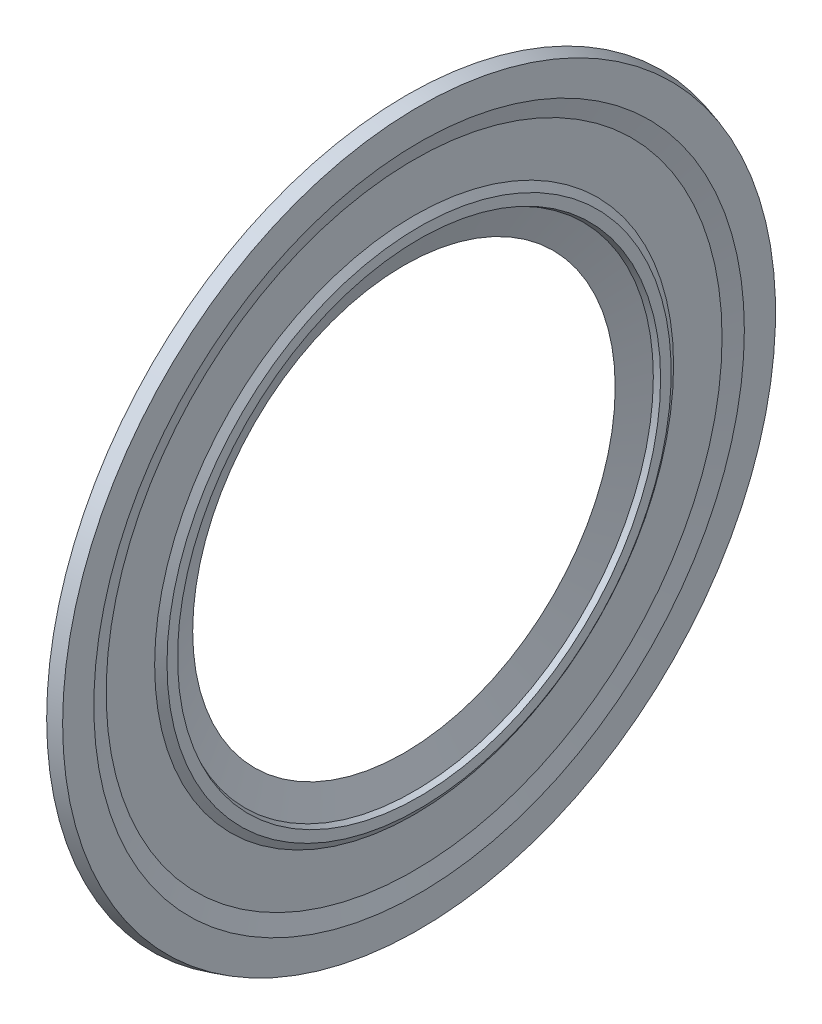
ISO-10303-21;
HEADER;
FILE_DESCRIPTION(('STEP AP214'),'2;1');
FILE_NAME('part.step','',(''),(''),'','','');
FILE_SCHEMA(('AUTOMOTIVE_DESIGN { 1 0 10303 214 1 1 1 1 }'));
ENDSEC;
DATA;
#1=APPLICATION_CONTEXT('core data for automotive mechanical design processes');
#2=APPLICATION_PROTOCOL_DEFINITION('international standard','automotive_design',2000,#1);
#3=PRODUCT_CONTEXT('',#1,'mechanical');
#4=PRODUCT('Part','Part','',(#3));
#5=PRODUCT_RELATED_PRODUCT_CATEGORY('part','',(#4));
#6=PRODUCT_DEFINITION_FORMATION('','',#4);
#7=PRODUCT_DEFINITION_CONTEXT('part definition',#1,'design');
#8=PRODUCT_DEFINITION('design','',#6,#7);
#9=PRODUCT_DEFINITION_SHAPE('','',#8);
#10=(LENGTH_UNIT() NAMED_UNIT(*) SI_UNIT(.MILLI.,.METRE.));
#11=(NAMED_UNIT(*) PLANE_ANGLE_UNIT() SI_UNIT($,.RADIAN.));
#12=(NAMED_UNIT(*) SI_UNIT($,.STERADIAN.) SOLID_ANGLE_UNIT());
#13=UNCERTAINTY_MEASURE_WITH_UNIT(LENGTH_MEASURE(1.E-05),#10,'distance_accuracy_value','');
#14=(GEOMETRIC_REPRESENTATION_CONTEXT(3) GLOBAL_UNCERTAINTY_ASSIGNED_CONTEXT((#13)) GLOBAL_UNIT_ASSIGNED_CONTEXT((#10,
#11,#12)) REPRESENTATION_CONTEXT('',''));
#15=CARTESIAN_POINT('',(0.,0.,0.));
#16=DIRECTION('',(0.,0.,1.));
#17=DIRECTION('',(1.,0.,0.));
#18=AXIS2_PLACEMENT_3D('',#15,#16,#17);
#19=CARTESIAN_POINT('',(5.772,6.16567962003259,0.));
#20=DIRECTION('',(1.,0.,0.));
#21=DIRECTION('',(0.,0.,-1.));
#22=AXIS2_PLACEMENT_3D('',#19,#20,#21);
#23=PLANE('',#22);
#24=CARTESIAN_POINT('',(5.77199999997902,0.,0.));
#25=DIRECTION('',(-1.,0.,0.));
#26=DIRECTION('',(0.,0.,1.));
#27=AXIS2_PLACEMENT_3D('',#24,#25,#26);
#28=CIRCLE('',#27,5.63899999997375);
#29=CARTESIAN_POINT('',(5.77199999997902,0.,5.63899999997375));
#30=VERTEX_POINT('',#29);
#31=EDGE_CURVE('E19',#30,#30,#28,.F.);
#32=ORIENTED_EDGE('',*,*,#31,.F.);
#33=EDGE_LOOP('',(#32));
#34=FACE_BOUND('',#33,.T.);
#35=CARTESIAN_POINT('',(5.77199999997902,0.,0.));
#36=DIRECTION('',(1.,0.,0.));
#37=DIRECTION('',(0.,0.,-1.));
#38=AXIS2_PLACEMENT_3D('',#35,#36,#37);
#39=CIRCLE('',#38,6.69235924004852);
#40=CARTESIAN_POINT('',(5.77199999997902,0.,-6.69235924004852));
#41=VERTEX_POINT('',#40);
#42=EDGE_CURVE('E50',#41,#41,#39,.T.);
#43=ORIENTED_EDGE('',*,*,#42,.T.);
#44=EDGE_LOOP('',(#43));
#45=FACE_BOUND('',#44,.T.);
#46=ADVANCED_FACE('F16',(#34,#45),#23,.T.);
#47=CARTESIAN_POINT('',(5.77199999997902,0.,0.));
#48=DIRECTION('',(-1.,0.,0.));
#49=DIRECTION('',(0.,0.,1.));
#50=AXIS2_PLACEMENT_3D('',#47,#48,#49);
#51=CONICAL_SURFACE('',#50,5.63899999997375,0.977384381055969);
#52=CARTESIAN_POINT('',(5.87999999999056,0.,0.));
#53=DIRECTION('',(-1.,0.,0.));
#54=DIRECTION('',(0.,0.,1.));
#55=AXIS2_PLACEMENT_3D('',#52,#53,#54);
#56=CIRCLE('',#55,5.47888341537828);
#57=CARTESIAN_POINT('',(5.87999999999056,0.,5.47888341537828));
#58=VERTEX_POINT('',#57);
#59=EDGE_CURVE('E48',#58,#58,#56,.F.);
#60=ORIENTED_EDGE('',*,*,#59,.F.);
#61=EDGE_LOOP('',(#60));
#62=FACE_BOUND('',#61,.T.);
#63=ORIENTED_EDGE('',*,*,#31,.T.);
#64=EDGE_LOOP('',(#63));
#65=FACE_BOUND('',#64,.T.);
#66=ADVANCED_FACE('F57',(#62,#65),#51,.T.);
#67=CARTESIAN_POINT('',(5.87999999999056,0.,0.));
#68=DIRECTION('',(1.,0.,0.));
#69=DIRECTION('',(0.,0.,-1.));
#70=AXIS2_PLACEMENT_3D('',#67,#68,#69);
#71=CONICAL_SURFACE('',#70,7.06900000000132,1.29154364646014);
#72=ORIENTED_EDGE('',*,*,#42,.F.);
#73=EDGE_LOOP('',(#72));
#74=FACE_BOUND('',#73,.T.);
#75=CARTESIAN_POINT('',(5.87999999999056,0.,0.));
#76=DIRECTION('',(1.,0.,0.));
#77=DIRECTION('',(0.,0.,-1.));
#78=AXIS2_PLACEMENT_3D('',#75,#76,#77);
#79=CIRCLE('',#78,7.06900000000132);
#80=CARTESIAN_POINT('',(5.87999999999056,0.,-7.06900000000132));
#81=VERTEX_POINT('',#80);
#82=EDGE_CURVE('E45',#81,#81,#79,.F.);
#83=ORIENTED_EDGE('',*,*,#82,.F.);
#84=EDGE_LOOP('',(#83));
#85=FACE_BOUND('',#84,.T.);
#86=ADVANCED_FACE('F64',(#74,#85),#71,.F.);
#87=CARTESIAN_POINT('',(5.88,5.36394170770031,0.));
#88=DIRECTION('',(1.,0.,0.));
#89=DIRECTION('',(0.,0.,-1.));
#90=AXIS2_PLACEMENT_3D('',#87,#88,#89);
#91=PLANE('',#90);
#92=CARTESIAN_POINT('',(5.87999999999056,0.,0.));
#93=DIRECTION('',(1.,0.,0.));
#94=DIRECTION('',(0.,0.,-1.));
#95=AXIS2_PLACEMENT_3D('',#92,#93,#94);
#96=CIRCLE('',#95,5.24899999999207);
#97=CARTESIAN_POINT('',(5.87999999999056,0.,-5.24899999999207));
#98=VERTEX_POINT('',#97);
#99=EDGE_CURVE('E42',#98,#98,#96,.F.);
#100=ORIENTED_EDGE('',*,*,#99,.T.);
#101=EDGE_LOOP('',(#100));
#102=FACE_BOUND('',#101,.T.);
#103=ORIENTED_EDGE('',*,*,#59,.T.);
#104=EDGE_LOOP('',(#103));
#105=FACE_BOUND('',#104,.T.);
#106=ADVANCED_FACE('F125',(#102,#105),#91,.T.);
#107=CARTESIAN_POINT('',(5.88,7.40795472314553,0.));
#108=DIRECTION('',(1.,0.,0.));
#109=DIRECTION('',(0.,0.,-1.));
#110=AXIS2_PLACEMENT_3D('',#107,#108,#109);
#111=PLANE('',#110);
#112=ORIENTED_EDGE('',*,*,#82,.T.);
#113=EDGE_LOOP('',(#112));
#114=FACE_BOUND('',#113,.T.);
#115=CARTESIAN_POINT('',(5.88,0.,0.));
#116=DIRECTION('',(-1.,0.,0.));
#117=DIRECTION('',(0.,0.,1.));
#118=AXIS2_PLACEMENT_3D('',#115,#116,#117);
#119=CIRCLE('',#118,7.74690944629107);
#120=CARTESIAN_POINT('',(5.88,0.,7.74690944629107));
#121=VERTEX_POINT('',#120);
#122=EDGE_CURVE('E39',#121,#121,#119,.T.);
#123=ORIENTED_EDGE('',*,*,#122,.F.);
#124=EDGE_LOOP('',(#123));
#125=FACE_BOUND('',#124,.T.);
#126=ADVANCED_FACE('F121',(#114,#125),#111,.T.);
#127=CARTESIAN_POINT('',(5.87999999999056,0.,0.));
#128=DIRECTION('',(1.,0.,0.));
#129=DIRECTION('',(0.,0.,-1.));
#130=AXIS2_PLACEMENT_3D('',#127,#128,#129);
#131=CONICAL_SURFACE('',#130,5.24899999999207,0.436332313074606);
#132=ORIENTED_EDGE('',*,*,#99,.F.);
#133=EDGE_LOOP('',(#132));
#134=FACE_BOUND('',#133,.T.);
#135=CARTESIAN_POINT('',(5.77200000000744,0.,0.));
#136=DIRECTION('',(1.,0.,0.));
#137=DIRECTION('',(0.,1.,0.));
#138=AXIS2_PLACEMENT_3D('',#135,#136,#137);
#139=CIRCLE('',#138,5.19863877292437);
#140=CARTESIAN_POINT('',(5.77200000000744,5.19863877292437,0.));
#141=VERTEX_POINT('',#140);
#142=EDGE_CURVE('E37',#141,#141,#139,.F.);
#143=ORIENTED_EDGE('',*,*,#142,.T.);
#144=EDGE_LOOP('',(#143));
#145=FACE_BOUND('',#144,.T.);
#146=ADVANCED_FACE('F103',(#134,#145),#131,.F.);
#147=CARTESIAN_POINT('',(5.61022769398884,0.,0.));
#148=DIRECTION('',(-1.,0.,0.));
#149=DIRECTION('',(0.,0.,1.));
#150=AXIS2_PLACEMENT_3D('',#147,#148,#149);
#151=CONICAL_SURFACE('',#150,7.82426541024528,0.279252680319085);
#152=ORIENTED_EDGE('',*,*,#122,.T.);
#153=EDGE_LOOP('',(#152));
#154=FACE_BOUND('',#153,.T.);
#155=CARTESIAN_POINT('',(5.61022769398884,0.,0.));
#156=DIRECTION('',(1.,0.,0.));
#157=DIRECTION('',(0.,1.,0.));
#158=AXIS2_PLACEMENT_3D('',#155,#156,#157);
#159=CIRCLE('',#158,7.82426541024527);
#160=CARTESIAN_POINT('',(5.61022769398884,7.82426541024527,0.));
#161=VERTEX_POINT('',#160);
#162=EDGE_CURVE('E33',#161,#161,#159,.F.);
#163=ORIENTED_EDGE('',*,*,#162,.F.);
#164=EDGE_LOOP('',(#163));
#165=FACE_BOUND('',#164,.T.);
#166=ADVANCED_FACE('F108',(#154,#165),#151,.T.);
#167=CARTESIAN_POINT('',(5.77200000000744,0.,0.));
#168=DIRECTION('',(1.,0.,0.));
#169=DIRECTION('',(0.,0.,-1.));
#170=AXIS2_PLACEMENT_3D('',#167,#168,#169);
#171=CONICAL_SURFACE('',#170,5.19863877292437,1.22173047634779);
#172=ORIENTED_EDGE('',*,*,#142,.F.);
#173=EDGE_LOOP('',(#172));
#174=FACE_BOUND('',#173,.T.);
#175=CARTESIAN_POINT('',(5.55088648444606,0.,0.));
#176=DIRECTION('',(-1.,0.,0.));
#177=DIRECTION('',(0.,0.,1.));
#178=AXIS2_PLACEMENT_3D('',#175,#176,#177);
#179=CIRCLE('',#178,4.5911343817986);
#180=CARTESIAN_POINT('',(5.55088648444606,0.,4.5911343817986));
#181=VERTEX_POINT('',#180);
#182=EDGE_CURVE('E28',#181,#181,#179,.F.);
#183=ORIENTED_EDGE('',*,*,#182,.F.);
#184=EDGE_LOOP('',(#183));
#185=FACE_BOUND('',#184,.T.);
#186=ADVANCED_FACE('F105',(#174,#185),#171,.F.);
#187=CARTESIAN_POINT('',(5.61022769398884,0.,0.));
#188=DIRECTION('',(1.,0.,0.));
#189=DIRECTION('',(0.,0.,-1.));
#190=AXIS2_PLACEMENT_3D('',#187,#188,#189);
#191=CONICAL_SURFACE('',#190,7.82426541024527,1.1693705988362);
#192=ORIENTED_EDGE('',*,*,#162,.T.);
#193=EDGE_LOOP('',(#192));
#194=FACE_BOUND('',#193,.T.);
#195=CARTESIAN_POINT('',(5.4,0.,0.));
#196=DIRECTION('',(1.,0.,0.));
#197=DIRECTION('',(0.,0.,-1.));
#198=AXIS2_PLACEMENT_3D('',#195,#196,#197);
#199=CIRCLE('',#198,7.329);
#200=CARTESIAN_POINT('',(5.4,0.,-7.329));
#201=VERTEX_POINT('',#200);
#202=EDGE_CURVE('E23',#201,#201,#199,.F.);
#203=ORIENTED_EDGE('',*,*,#202,.F.);
#204=EDGE_LOOP('',(#203));
#205=FACE_BOUND('',#204,.T.);
#206=ADVANCED_FACE('F72',(#194,#205),#191,.T.);
#207=CARTESIAN_POINT('',(5.99999999999999,0.,0.));
#208=DIRECTION('',(-1.,0.,0.));
#209=DIRECTION('',(0.,0.,1.));
#210=AXIS2_PLACEMENT_3D('',#207,#208,#209);
#211=TOROIDAL_SURFACE('',#210,4.989,0.599999999999993);
#212=CARTESIAN_POINT('',(5.4,0.,0.));
#213=DIRECTION('',(-1.,0.,0.));
#214=DIRECTION('',(0.,0.,-1.));
#215=AXIS2_PLACEMENT_3D('',#212,#213,#214);
#216=CIRCLE('',#215,4.989);
#217=CARTESIAN_POINT('',(5.4,0.,-4.989));
#218=VERTEX_POINT('',#217);
#219=EDGE_CURVE('E10',#218,#218,#216,.F.);
#220=ORIENTED_EDGE('',*,*,#219,.F.);
#221=EDGE_LOOP('',(#220));
#222=FACE_BOUND('',#221,.T.);
#223=ORIENTED_EDGE('',*,*,#182,.T.);
#224=EDGE_LOOP('',(#223));
#225=FACE_BOUND('',#224,.T.);
#226=ADVANCED_FACE('F68',(#222,#225),#211,.T.);
#227=CARTESIAN_POINT('',(5.4,6.159,0.));
#228=DIRECTION('',(-1.,0.,0.));
#229=DIRECTION('',(0.,0.,1.));
#230=AXIS2_PLACEMENT_3D('',#227,#228,#229);
#231=PLANE('',#230);
#232=ORIENTED_EDGE('',*,*,#219,.T.);
#233=EDGE_LOOP('',(#232));
#234=FACE_BOUND('',#233,.T.);
#235=ORIENTED_EDGE('',*,*,#202,.T.);
#236=EDGE_LOOP('',(#235));
#237=FACE_BOUND('',#236,.T.);
#238=ADVANCED_FACE('F66',(#234,#237),#231,.T.);
#239=CLOSED_SHELL('',(#46,#66,#86,#106,#126,#146,#166,#186,#206,#226,#238));
#240=MANIFOLD_SOLID_BREP('B1',#239);
#241=ADVANCED_BREP_SHAPE_REPRESENTATION('',(#18,#240),#14);
#242=SHAPE_DEFINITION_REPRESENTATION(#9,#241);
ENDSEC;
END-ISO-10303-21;
